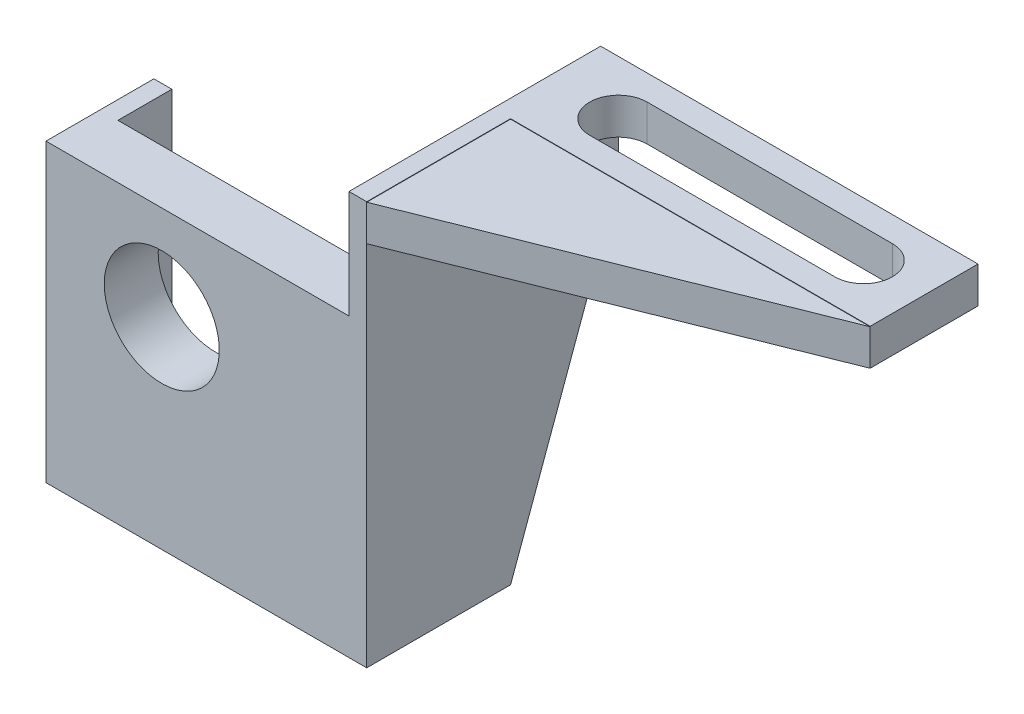
ISO-10303-21;
HEADER;
FILE_DESCRIPTION(('STEP AP214'),'2;1');
FILE_NAME('part.step','',(''),(''),'','','');
FILE_SCHEMA(('AUTOMOTIVE_DESIGN { 1 0 10303 214 1 1 1 1 }'));
ENDSEC;
DATA;
#1=APPLICATION_CONTEXT('core data for automotive mechanical design processes');
#2=APPLICATION_PROTOCOL_DEFINITION('international standard','automotive_design',2000,#1);
#3=PRODUCT_CONTEXT('',#1,'mechanical');
#4=PRODUCT('Part','Part','',(#3));
#5=PRODUCT_RELATED_PRODUCT_CATEGORY('part','',(#4));
#6=PRODUCT_DEFINITION_FORMATION('','',#4);
#7=PRODUCT_DEFINITION_CONTEXT('part definition',#1,'design');
#8=PRODUCT_DEFINITION('design','',#6,#7);
#9=PRODUCT_DEFINITION_SHAPE('','',#8);
#10=(LENGTH_UNIT() NAMED_UNIT(*) SI_UNIT(.MILLI.,.METRE.));
#11=(NAMED_UNIT(*) PLANE_ANGLE_UNIT() SI_UNIT($,.RADIAN.));
#12=(NAMED_UNIT(*) SI_UNIT($,.STERADIAN.) SOLID_ANGLE_UNIT());
#13=UNCERTAINTY_MEASURE_WITH_UNIT(LENGTH_MEASURE(1.E-05),#10,'distance_accuracy_value','');
#14=(GEOMETRIC_REPRESENTATION_CONTEXT(3) GLOBAL_UNCERTAINTY_ASSIGNED_CONTEXT((#13)) GLOBAL_UNIT_ASSIGNED_CONTEXT((#10,
#11,#12)) REPRESENTATION_CONTEXT('',''));
#15=CARTESIAN_POINT('',(0.,0.,0.));
#16=DIRECTION('',(0.,0.,1.));
#17=DIRECTION('',(1.,0.,0.));
#18=AXIS2_PLACEMENT_3D('',#15,#16,#17);
#19=CARTESIAN_POINT('',(-73.255482094098,0.,0.));
#20=DIRECTION('',(1.,0.,0.));
#21=DIRECTION('',(0.,-1.,0.));
#22=AXIS2_PLACEMENT_3D('',#19,#20,#21);
#23=PLANE('',#22);
#24=DIRECTION('',(0.,1.,0.));
#25=VECTOR('',#24,1.);
#26=CARTESIAN_POINT('',(-73.255482094098,7.3452534562212,3.));
#27=LINE('',#26,#25);
#28=CARTESIAN_POINT('',(-73.255482094098,-9.1097465437788,3.));
#29=VERTEX_POINT('',#28);
#30=CARTESIAN_POINT('',(-73.255482094098,11.3211667033944,3.));
#31=VERTEX_POINT('',#30);
#32=EDGE_CURVE('E373',#29,#31,#27,.T.);
#33=ORIENTED_EDGE('',*,*,#32,.F.);
#34=DIRECTION('',(0.,0.,1.));
#35=VECTOR('',#34,1.);
#36=CARTESIAN_POINT('',(-73.255482094098,-9.1097465437788,0.));
#37=LINE('',#36,#35);
#38=CARTESIAN_POINT('',(-73.255482094098,-9.1097465437788,-5.));
#39=VERTEX_POINT('',#38);
#40=EDGE_CURVE('E369',#39,#29,#37,.T.);
#41=ORIENTED_EDGE('',*,*,#40,.F.);
#42=DIRECTION('',(0.,-0.939493001584619,0.342568095381812));
#43=VECTOR('',#42,1.);
#44=CARTESIAN_POINT('',(-73.255482094098,7.3452534562212,-11.));
#45=LINE('',#44,#43);
#46=CARTESIAN_POINT('',(-73.255482094098,7.3452534562212,-11.));
#47=VERTEX_POINT('',#46);
#48=EDGE_CURVE('E313',#47,#39,#45,.T.);
#49=ORIENTED_EDGE('',*,*,#48,.F.);
#50=DIRECTION('',(0.,1.,0.));
#51=VECTOR('',#50,1.);
#52=CARTESIAN_POINT('',(-73.255482094098,13.3452534562212,-11.));
#53=LINE('',#52,#51);
#54=CARTESIAN_POINT('',(-73.255482094098,11.3211667033944,-11.));
#55=VERTEX_POINT('',#54);
#56=EDGE_CURVE('E331',#47,#55,#53,.T.);
#57=ORIENTED_EDGE('',*,*,#56,.T.);
#58=DIRECTION('',(0.,0.,1.));
#59=VECTOR('',#58,1.);
#60=CARTESIAN_POINT('',(-73.255482094098,11.3211667033944,-11.));
#61=LINE('',#60,#59);
#62=EDGE_CURVE('E195',#55,#31,#61,.T.);
#63=ORIENTED_EDGE('',*,*,#62,.T.);
#64=EDGE_LOOP('',(#33,#41,#49,#57,#63));
#65=FACE_BOUND('',#64,.T.);
#66=ADVANCED_FACE('F45',(#65),#23,.T.);
#67=CARTESIAN_POINT('',(-83.7793032493779,0.,0.));
#68=DIRECTION('',(0.,0.,1.));
#69=DIRECTION('',(-1.,0.,0.));
#70=AXIS2_PLACEMENT_3D('',#67,#68,#69);
#71=PLANE('',#70);
#72=CARTESIAN_POINT('',(-84.655482094098,2.0902534562212,0.));
#73=DIRECTION('',(0.,0.,-1.));
#74=DIRECTION('',(-1.,0.,0.));
#75=AXIS2_PLACEMENT_3D('',#72,#73,#74);
#76=CIRCLE('',#75,3.2);
#77=CARTESIAN_POINT('',(-87.855482094098,2.0902534562212,0.));
#78=VERTEX_POINT('',#77);
#79=EDGE_CURVE('E386',#78,#78,#76,.T.);
#80=ORIENTED_EDGE('',*,*,#79,.F.);
#81=EDGE_LOOP('',(#80));
#82=FACE_BOUND('',#81,.T.);
#83=CARTESIAN_POINT('',(-84.655482094098,-6.0797465437788,0.));
#84=DIRECTION('',(0.,0.,-1.));
#85=DIRECTION('',(-1.,0.,0.));
#86=AXIS2_PLACEMENT_3D('',#83,#84,#85);
#87=CIRCLE('',#86,1.65);
#88=CARTESIAN_POINT('',(-86.305482094098,-6.0797465437788,0.));
#89=VERTEX_POINT('',#88);
#90=EDGE_CURVE('E11',#89,#89,#87,.F.);
#91=ORIENTED_EDGE('',*,*,#90,.T.);
#92=EDGE_LOOP('',(#91));
#93=FACE_BOUND('',#92,.T.);
#94=DIRECTION('',(0.,1.,0.));
#95=VECTOR('',#94,1.);
#96=CARTESIAN_POINT('',(-90.095482094098,7.3452534562212,0.));
#97=LINE('',#96,#95);
#98=CARTESIAN_POINT('',(-90.095482094098,-9.1097465437788,0.));
#99=VERTEX_POINT('',#98);
#100=CARTESIAN_POINT('',(-90.095482094098,7.3452534562212,0.));
#101=VERTEX_POINT('',#100);
#102=EDGE_CURVE('E206',#99,#101,#97,.T.);
#103=ORIENTED_EDGE('',*,*,#102,.T.);
#104=DIRECTION('',(1.,0.,0.));
#105=VECTOR('',#104,1.);
#106=CARTESIAN_POINT('',(-77.255482094098,7.3452534562212,0.));
#107=LINE('',#106,#105);
#108=CARTESIAN_POINT('',(-74.255482094098,7.3452534562212,0.));
#109=VERTEX_POINT('',#108);
#110=EDGE_CURVE('E394',#101,#109,#107,.T.);
#111=ORIENTED_EDGE('',*,*,#110,.T.);
#112=DIRECTION('',(0.,-1.,0.));
#113=VECTOR('',#112,1.);
#114=CARTESIAN_POINT('',(-74.255482094098,7.3452534562212,0.));
#115=LINE('',#114,#113);
#116=CARTESIAN_POINT('',(-74.255482094098,-9.1097465437788,0.));
#117=VERTEX_POINT('',#116);
#118=EDGE_CURVE('E356',#109,#117,#115,.T.);
#119=ORIENTED_EDGE('',*,*,#118,.T.);
#120=DIRECTION('',(-1.,0.,0.));
#121=VECTOR('',#120,1.);
#122=CARTESIAN_POINT('',(-77.255482094098,-9.1097465437788,0.));
#123=LINE('',#122,#121);
#124=EDGE_CURVE('E382',#117,#99,#123,.T.);
#125=ORIENTED_EDGE('',*,*,#124,.T.);
#126=EDGE_LOOP('',(#103,#111,#119,#125));
#127=FACE_BOUND('',#126,.T.);
#128=ADVANCED_FACE('F404',(#82,#93,#127),#71,.F.);
#129=CARTESIAN_POINT('',(-77.255482094098,7.3452534562212,3.));
#130=DIRECTION('',(0.,-1.,0.));
#131=DIRECTION('',(0.,0.,-1.));
#132=AXIS2_PLACEMENT_3D('',#129,#130,#131);
#133=PLANE('',#132);
#134=DIRECTION('',(0.,0.,-1.));
#135=VECTOR('',#134,1.);
#136=CARTESIAN_POINT('',(-74.2437734444606,7.3452534562212,-5.));
#137=LINE('',#136,#135);
#138=CARTESIAN_POINT('',(-74.2437734444606,7.3452534562212,3.));
#139=VERTEX_POINT('',#138);
#140=CARTESIAN_POINT('',(-74.2437734444606,7.3452534562212,-11.));
#141=VERTEX_POINT('',#140);
#142=EDGE_CURVE('E338',#139,#141,#137,.T.);
#143=ORIENTED_EDGE('',*,*,#142,.T.);
#144=DIRECTION('',(1.,0.,0.));
#145=VECTOR('',#144,1.);
#146=CARTESIAN_POINT('',(-74.255482094098,7.3452534562212,-11.));
#147=LINE('',#146,#145);
#148=CARTESIAN_POINT('',(-74.255482094098,7.3452534562212,-11.));
#149=VERTEX_POINT('',#148);
#150=EDGE_CURVE('E317',#149,#141,#147,.T.);
#151=ORIENTED_EDGE('',*,*,#150,.F.);
#152=DIRECTION('',(0.,0.,1.));
#153=VECTOR('',#152,1.);
#154=CARTESIAN_POINT('',(-74.255482094098,7.3452534562212,-5.));
#155=LINE('',#154,#153);
#156=EDGE_CURVE('E366',#149,#109,#155,.T.);
#157=ORIENTED_EDGE('',*,*,#156,.T.);
#158=ORIENTED_EDGE('',*,*,#110,.F.);
#159=DIRECTION('',(0.,0.,1.));
#160=VECTOR('',#159,1.);
#161=CARTESIAN_POINT('',(-90.095482094098,7.3452534562212,-3.));
#162=LINE('',#161,#160);
#163=CARTESIAN_POINT('',(-90.095482094098,7.3452534562212,-3.));
#164=VERTEX_POINT('',#163);
#165=EDGE_CURVE('E228',#164,#101,#162,.T.);
#166=ORIENTED_EDGE('',*,*,#165,.F.);
#167=DIRECTION('',(-1.,0.,0.));
#168=VECTOR('',#167,1.);
#169=CARTESIAN_POINT('',(-91.095482094098,7.3452534562212,-3.));
#170=LINE('',#169,#168);
#171=CARTESIAN_POINT('',(-91.095482094098,7.3452534562212,-3.));
#172=VERTEX_POINT('',#171);
#173=EDGE_CURVE('E224',#164,#172,#170,.T.);
#174=ORIENTED_EDGE('',*,*,#173,.T.);
#175=DIRECTION('',(0.,0.,1.));
#176=VECTOR('',#175,1.);
#177=CARTESIAN_POINT('',(-91.095482094098,7.3452534562212,3.));
#178=LINE('',#177,#176);
#179=CARTESIAN_POINT('',(-91.095482094098,7.3452534562212,3.));
#180=VERTEX_POINT('',#179);
#181=EDGE_CURVE('E245',#172,#180,#178,.T.);
#182=ORIENTED_EDGE('',*,*,#181,.T.);
#183=DIRECTION('',(1.,0.,0.));
#184=VECTOR('',#183,1.);
#185=CARTESIAN_POINT('',(-77.255482094098,7.3452534562212,3.));
#186=LINE('',#185,#184);
#187=EDGE_CURVE('E54',#180,#139,#186,.T.);
#188=ORIENTED_EDGE('',*,*,#187,.T.);
#189=EDGE_LOOP('',(#143,#151,#157,#158,#166,#174,#182,#188));
#190=FACE_BOUND('',#189,.T.);
#191=ADVANCED_FACE('F47',(#190),#133,.F.);
#192=CARTESIAN_POINT('',(-83.7793032493779,0.,3.));
#193=DIRECTION('',(0.,0.,1.));
#194=DIRECTION('',(-1.,0.,0.));
#195=AXIS2_PLACEMENT_3D('',#192,#193,#194);
#196=PLANE('',#195);
#197=DIRECTION('',(-1.,0.,0.));
#198=VECTOR('',#197,1.);
#199=CARTESIAN_POINT('',(-77.255482094098,-9.1097465437788,3.));
#200=LINE('',#199,#198);
#201=CARTESIAN_POINT('',(-91.095482094098,-9.1097465437788,3.));
#202=VERTEX_POINT('',#201);
#203=EDGE_CURVE('E381',#29,#202,#200,.T.);
#204=ORIENTED_EDGE('',*,*,#203,.F.);
#205=ORIENTED_EDGE('',*,*,#32,.T.);
#206=DIRECTION('',(0.,-1.,0.));
#207=VECTOR('',#206,1.);
#208=CARTESIAN_POINT('',(-73.255482094098,13.3211667033944,3.));
#209=LINE('',#208,#207);
#210=CARTESIAN_POINT('',(-73.255482094098,13.3211667033944,3.));
#211=VERTEX_POINT('',#210);
#212=EDGE_CURVE('E202',#211,#31,#209,.T.);
#213=ORIENTED_EDGE('',*,*,#212,.F.);
#214=CARTESIAN_POINT('',(-73.255482094098,13.3452534562212,3.));
#215=VERTEX_POINT('',#214);
#216=EDGE_CURVE('E199',#211,#215,#27,.T.);
#217=ORIENTED_EDGE('',*,*,#216,.T.);
#218=DIRECTION('',(-1.,0.,0.));
#219=VECTOR('',#218,1.);
#220=CARTESIAN_POINT('',(-73.255482094098,13.3452534562212,3.));
#221=LINE('',#220,#219);
#222=CARTESIAN_POINT('',(-74.2437734444606,13.3452534562212,3.));
#223=VERTEX_POINT('',#222);
#224=EDGE_CURVE('E342',#215,#223,#221,.T.);
#225=ORIENTED_EDGE('',*,*,#224,.T.);
#226=DIRECTION('',(0.,-1.,0.));
#227=VECTOR('',#226,1.);
#228=CARTESIAN_POINT('',(-74.2437734444606,13.3452534562212,3.));
#229=LINE('',#228,#227);
#230=EDGE_CURVE('E350',#223,#139,#229,.T.);
#231=ORIENTED_EDGE('',*,*,#230,.T.);
#232=ORIENTED_EDGE('',*,*,#187,.F.);
#233=DIRECTION('',(0.,-1.,0.));
#234=VECTOR('',#233,1.);
#235=CARTESIAN_POINT('',(-91.095482094098,7.3452534562212,3.));
#236=LINE('',#235,#234);
#237=EDGE_CURVE('E237',#180,#202,#236,.T.);
#238=ORIENTED_EDGE('',*,*,#237,.T.);
#239=EDGE_LOOP('',(#204,#205,#213,#217,#225,#231,#232,#238));
#240=FACE_BOUND('',#239,.T.);
#241=CARTESIAN_POINT('',(-84.655482094098,2.0902534562212,3.));
#242=DIRECTION('',(0.,0.,-1.));
#243=DIRECTION('',(-1.,0.,0.));
#244=AXIS2_PLACEMENT_3D('',#241,#242,#243);
#245=CIRCLE('',#244,3.2);
#246=CARTESIAN_POINT('',(-87.855482094098,2.0902534562212,3.));
#247=VERTEX_POINT('',#246);
#248=EDGE_CURVE('E390',#247,#247,#245,.T.);
#249=ORIENTED_EDGE('',*,*,#248,.T.);
#250=EDGE_LOOP('',(#249));
#251=FACE_BOUND('',#250,.T.);
#252=ADVANCED_FACE('F431',(#240,#251),#196,.T.);
#253=CARTESIAN_POINT('',(-84.655482094098,2.0902534562212,3.));
#254=DIRECTION('',(0.,0.,-1.));
#255=DIRECTION('',(1.,0.,0.));
#256=AXIS2_PLACEMENT_3D('',#253,#254,#255);
#257=CYLINDRICAL_SURFACE('',#256,3.2);
#258=ORIENTED_EDGE('',*,*,#248,.F.);
#259=EDGE_LOOP('',(#258));
#260=FACE_BOUND('',#259,.T.);
#261=ORIENTED_EDGE('',*,*,#79,.T.);
#262=EDGE_LOOP('',(#261));
#263=FACE_BOUND('',#262,.T.);
#264=ADVANCED_FACE('F496',(#260,#263),#257,.F.);
#265=CARTESIAN_POINT('',(-77.255482094098,-9.1097465437788,0.));
#266=DIRECTION('',(0.,-1.,0.));
#267=DIRECTION('',(0.,0.,-1.));
#268=AXIS2_PLACEMENT_3D('',#265,#266,#267);
#269=PLANE('',#268);
#270=DIRECTION('',(0.,0.,-1.));
#271=VECTOR('',#270,1.);
#272=CARTESIAN_POINT('',(-91.095482094098,-9.1097465437788,3.));
#273=LINE('',#272,#271);
#274=CARTESIAN_POINT('',(-91.095482094098,-9.1097465437788,-3.));
#275=VERTEX_POINT('',#274);
#276=EDGE_CURVE('E241',#202,#275,#273,.T.);
#277=ORIENTED_EDGE('',*,*,#276,.T.);
#278=DIRECTION('',(1.,0.,0.));
#279=VECTOR('',#278,1.);
#280=CARTESIAN_POINT('',(-91.095482094098,-9.1097465437788,-3.));
#281=LINE('',#280,#279);
#282=CARTESIAN_POINT('',(-90.095482094098,-9.1097465437788,-3.));
#283=VERTEX_POINT('',#282);
#284=EDGE_CURVE('E217',#275,#283,#281,.T.);
#285=ORIENTED_EDGE('',*,*,#284,.T.);
#286=DIRECTION('',(0.,0.,1.));
#287=VECTOR('',#286,1.);
#288=CARTESIAN_POINT('',(-90.095482094098,-9.1097465437788,-3.));
#289=LINE('',#288,#287);
#290=EDGE_CURVE('E234',#283,#99,#289,.T.);
#291=ORIENTED_EDGE('',*,*,#290,.T.);
#292=ORIENTED_EDGE('',*,*,#124,.F.);
#293=DIRECTION('',(0.,0.,1.));
#294=VECTOR('',#293,1.);
#295=CARTESIAN_POINT('',(-74.255482094098,-9.1097465437788,-5.));
#296=LINE('',#295,#294);
#297=CARTESIAN_POINT('',(-74.255482094098,-9.1097465437788,-5.));
#298=VERTEX_POINT('',#297);
#299=EDGE_CURVE('E360',#298,#117,#296,.T.);
#300=ORIENTED_EDGE('',*,*,#299,.F.);
#301=DIRECTION('',(1.,0.,0.));
#302=VECTOR('',#301,1.);
#303=CARTESIAN_POINT('',(-73.255482094098,-9.1097465437788,-5.));
#304=LINE('',#303,#302);
#305=EDGE_CURVE('E357',#298,#39,#304,.T.);
#306=ORIENTED_EDGE('',*,*,#305,.T.);
#307=ORIENTED_EDGE('',*,*,#40,.T.);
#308=ORIENTED_EDGE('',*,*,#203,.T.);
#309=EDGE_LOOP('',(#277,#285,#291,#292,#300,#306,#307,#308));
#310=FACE_BOUND('',#309,.T.);
#311=ADVANCED_FACE('F417',(#310),#269,.T.);
#312=CARTESIAN_POINT('',(-84.655482094098,-6.0797465437788,-3.));
#313=DIRECTION('',(0.,0.,1.));
#314=DIRECTION('',(-1.,0.,0.));
#315=AXIS2_PLACEMENT_3D('',#312,#313,#314);
#316=CYLINDRICAL_SURFACE('',#315,1.65);
#317=CARTESIAN_POINT('',(-84.655482094098,-6.0797465437788,-3.));
#318=DIRECTION('',(0.,0.,1.));
#319=DIRECTION('',(1.,0.,0.));
#320=AXIS2_PLACEMENT_3D('',#317,#318,#319);
#321=CIRCLE('',#320,1.65);
#322=CARTESIAN_POINT('',(-83.005482094098,-6.0797465437788,-3.));
#323=VERTEX_POINT('',#322);
#324=EDGE_CURVE('E377',#323,#323,#321,.T.);
#325=ORIENTED_EDGE('',*,*,#324,.T.);
#326=EDGE_LOOP('',(#325));
#327=FACE_BOUND('',#326,.T.);
#328=ORIENTED_EDGE('',*,*,#90,.F.);
#329=EDGE_LOOP('',(#328));
#330=FACE_BOUND('',#329,.T.);
#331=ADVANCED_FACE('F485',(#327,#330),#316,.T.);
#332=CARTESIAN_POINT('',(-84.655482094098,-6.0797465437788,-3.));
#333=DIRECTION('',(0.,0.,-1.));
#334=DIRECTION('',(1.,0.,0.));
#335=AXIS2_PLACEMENT_3D('',#332,#333,#334);
#336=PLANE('',#335);
#337=ORIENTED_EDGE('',*,*,#324,.F.);
#338=EDGE_LOOP('',(#337));
#339=FACE_BOUND('',#338,.T.);
#340=ADVANCED_FACE('F480',(#339),#336,.T.);
#341=DIRECTION('',(0.,0.,1.));
#342=VECTOR('',#341,1.);
#343=CARTESIAN_POINT('',(-73.255482094098,13.3211667033944,-5.));
#344=LINE('',#343,#342);
#345=CARTESIAN_POINT('',(-73.255482094098,13.3211667033944,-5.));
#346=VERTEX_POINT('',#345);
#347=EDGE_CURVE('E180',#346,#211,#344,.T.);
#348=ORIENTED_EDGE('',*,*,#347,.F.);
#349=DIRECTION('',(0.,1.,0.));
#350=VECTOR('',#349,1.);
#351=CARTESIAN_POINT('',(-73.255482094098,13.3452534562212,-5.));
#352=LINE('',#351,#350);
#353=CARTESIAN_POINT('',(-73.255482094098,13.3452534562212,-5.));
#354=VERTEX_POINT('',#353);
#355=EDGE_CURVE('E187',#346,#354,#352,.T.);
#356=ORIENTED_EDGE('',*,*,#355,.T.);
#357=DIRECTION('',(0.,0.,1.));
#358=VECTOR('',#357,1.);
#359=CARTESIAN_POINT('',(-73.255482094098,13.3452534562212,-5.));
#360=LINE('',#359,#358);
#361=EDGE_CURVE('E339',#354,#215,#360,.T.);
#362=ORIENTED_EDGE('',*,*,#361,.T.);
#363=ORIENTED_EDGE('',*,*,#216,.F.);
#364=EDGE_LOOP('',(#348,#356,#362,#363));
#365=FACE_BOUND('',#364,.T.);
#366=ADVANCED_FACE('F197',(#365),#23,.T.);
#367=CARTESIAN_POINT('',(-74.255482094098,7.3452534562212,-5.));
#368=DIRECTION('',(1.,0.,0.));
#369=DIRECTION('',(0.,-1.,0.));
#370=AXIS2_PLACEMENT_3D('',#367,#368,#369);
#371=PLANE('',#370);
#372=ORIENTED_EDGE('',*,*,#118,.F.);
#373=ORIENTED_EDGE('',*,*,#156,.F.);
#374=DIRECTION('',(0.,-0.939493001584619,0.342568095381812));
#375=VECTOR('',#374,1.);
#376=CARTESIAN_POINT('',(-74.255482094098,7.3452534562212,-11.));
#377=LINE('',#376,#375);
#378=EDGE_CURVE('E314',#149,#298,#377,.T.);
#379=ORIENTED_EDGE('',*,*,#378,.T.);
#380=ORIENTED_EDGE('',*,*,#299,.T.);
#381=EDGE_LOOP('',(#372,#373,#379,#380));
#382=FACE_BOUND('',#381,.T.);
#383=ADVANCED_FACE('F412',(#382),#371,.F.);
#384=CARTESIAN_POINT('',(-74.2437734444606,13.3452534562212,-5.));
#385=DIRECTION('',(1.,0.,0.));
#386=DIRECTION('',(0.,0.,1.));
#387=AXIS2_PLACEMENT_3D('',#384,#385,#386);
#388=PLANE('',#387);
#389=ORIENTED_EDGE('',*,*,#142,.F.);
#390=ORIENTED_EDGE('',*,*,#230,.F.);
#391=DIRECTION('',(0.,0.,-1.));
#392=VECTOR('',#391,1.);
#393=CARTESIAN_POINT('',(-74.2437734444606,13.3452534562212,-5.));
#394=LINE('',#393,#392);
#395=CARTESIAN_POINT('',(-74.2437734444606,13.3452534562212,-11.));
#396=VERTEX_POINT('',#395);
#397=EDGE_CURVE('E346',#223,#396,#394,.T.);
#398=ORIENTED_EDGE('',*,*,#397,.T.);
#399=DIRECTION('',(0.,-1.,0.));
#400=VECTOR('',#399,1.);
#401=CARTESIAN_POINT('',(-74.2437734444606,13.3452534562212,-11.));
#402=LINE('',#401,#400);
#403=EDGE_CURVE('E324',#396,#141,#402,.T.);
#404=ORIENTED_EDGE('',*,*,#403,.T.);
#405=EDGE_LOOP('',(#389,#390,#398,#404));
#406=FACE_BOUND('',#405,.T.);
#407=ADVANCED_FACE('F436',(#406),#388,.F.);
#408=CARTESIAN_POINT('',(-83.7793032493779,13.3452534562212,0.));
#409=DIRECTION('',(0.,1.,0.));
#410=DIRECTION('',(0.,0.,1.));
#411=AXIS2_PLACEMENT_3D('',#408,#409,#410);
#412=PLANE('',#411);
#413=CARTESIAN_POINT('',(-56.6191347499063,13.3452534562212,-8.));
#414=DIRECTION('',(0.,1.,0.));
#415=DIRECTION('',(-1.,0.,0.));
#416=AXIS2_PLACEMENT_3D('',#413,#414,#415);
#417=CIRCLE('',#416,1.6);
#418=CARTESIAN_POINT('',(-56.6191347499063,13.3452534562212,-6.4));
#419=VERTEX_POINT('',#418);
#420=CARTESIAN_POINT('',(-56.6191347499063,13.3452534562212,-9.6));
#421=VERTEX_POINT('',#420);
#422=EDGE_CURVE('E250',#419,#421,#417,.T.);
#423=ORIENTED_EDGE('',*,*,#422,.F.);
#424=DIRECTION('',(1.,0.,0.));
#425=VECTOR('',#424,1.);
#426=CARTESIAN_POINT('',(-56.6191347499063,13.3452534562212,-6.4));
#427=LINE('',#426,#425);
#428=CARTESIAN_POINT('',(-70.255482094098,13.3452534562212,-6.4));
#429=VERTEX_POINT('',#428);
#430=EDGE_CURVE('E261',#429,#419,#427,.T.);
#431=ORIENTED_EDGE('',*,*,#430,.F.);
#432=CARTESIAN_POINT('',(-70.255482094098,13.3452534562212,-8.));
#433=DIRECTION('',(0.,1.,0.));
#434=DIRECTION('',(-1.,0.,0.));
#435=AXIS2_PLACEMENT_3D('',#432,#433,#434);
#436=CIRCLE('',#435,1.6);
#437=CARTESIAN_POINT('',(-70.255482094098,13.3452534562212,-9.6));
#438=VERTEX_POINT('',#437);
#439=EDGE_CURVE('E258',#438,#429,#436,.T.);
#440=ORIENTED_EDGE('',*,*,#439,.F.);
#441=DIRECTION('',(-1.,0.,0.));
#442=VECTOR('',#441,1.);
#443=CARTESIAN_POINT('',(-56.6191347499063,13.3452534562212,-9.6));
#444=LINE('',#443,#442);
#445=EDGE_CURVE('E254',#421,#438,#444,.T.);
#446=ORIENTED_EDGE('',*,*,#445,.F.);
#447=EDGE_LOOP('',(#423,#431,#440,#446));
#448=FACE_BOUND('',#447,.T.);
#449=DIRECTION('',(-1.,0.,0.));
#450=VECTOR('',#449,1.);
#451=CARTESIAN_POINT('',(-74.2437734444606,13.3452534562212,-11.));
#452=LINE('',#451,#450);
#453=CARTESIAN_POINT('',(-53.255482094098,13.3452534562212,-11.));
#454=VERTEX_POINT('',#453);
#455=EDGE_CURVE('E335',#454,#396,#452,.T.);
#456=ORIENTED_EDGE('',*,*,#455,.T.);
#457=ORIENTED_EDGE('',*,*,#397,.F.);
#458=ORIENTED_EDGE('',*,*,#224,.F.);
#459=ORIENTED_EDGE('',*,*,#361,.F.);
#460=DIRECTION('',(-1.,0.,0.));
#461=VECTOR('',#460,1.);
#462=CARTESIAN_POINT('',(-53.255482094098,13.3452534562212,-5.));
#463=LINE('',#462,#461);
#464=CARTESIAN_POINT('',(-53.255482094098,13.3452534562212,-5.));
#465=VERTEX_POINT('',#464);
#466=EDGE_CURVE('E190',#465,#354,#463,.T.);
#467=ORIENTED_EDGE('',*,*,#466,.F.);
#468=DIRECTION('',(0.,0.,-1.));
#469=VECTOR('',#468,1.);
#470=CARTESIAN_POINT('',(-53.255482094098,13.3452534562212,-11.));
#471=LINE('',#470,#469);
#472=EDGE_CURVE('E301',#465,#454,#471,.T.);
#473=ORIENTED_EDGE('',*,*,#472,.T.);
#474=EDGE_LOOP('',(#456,#457,#458,#459,#467,#473));
#475=FACE_BOUND('',#474,.T.);
#476=ADVANCED_FACE('F458',(#448,#475),#412,.T.);
#477=CARTESIAN_POINT('',(-83.7793032493779,0.,-11.));
#478=DIRECTION('',(0.,0.,-1.));
#479=DIRECTION('',(1.,0.,0.));
#480=AXIS2_PLACEMENT_3D('',#477,#478,#479);
#481=PLANE('',#480);
#482=ORIENTED_EDGE('',*,*,#403,.F.);
#483=ORIENTED_EDGE('',*,*,#455,.F.);
#484=DIRECTION('',(0.,-1.,0.));
#485=VECTOR('',#484,1.);
#486=CARTESIAN_POINT('',(-53.255482094098,13.3452534562212,-11.));
#487=LINE('',#486,#485);
#488=CARTESIAN_POINT('',(-53.255482094098,11.3211667033944,-11.));
#489=VERTEX_POINT('',#488);
#490=EDGE_CURVE('E194',#454,#489,#487,.T.);
#491=ORIENTED_EDGE('',*,*,#490,.T.);
#492=DIRECTION('',(-1.,0.,0.));
#493=VECTOR('',#492,1.);
#494=CARTESIAN_POINT('',(-53.255482094098,11.3211667033944,-11.));
#495=LINE('',#494,#493);
#496=EDGE_CURVE('E310',#489,#55,#495,.T.);
#497=ORIENTED_EDGE('',*,*,#496,.T.);
#498=ORIENTED_EDGE('',*,*,#56,.F.);
#499=DIRECTION('',(1.,0.,0.));
#500=VECTOR('',#499,1.);
#501=CARTESIAN_POINT('',(-74.2437734444606,7.3452534562212,-11.));
#502=LINE('',#501,#500);
#503=EDGE_CURVE('E328',#141,#47,#502,.T.);
#504=ORIENTED_EDGE('',*,*,#503,.F.);
#505=EDGE_LOOP('',(#482,#483,#491,#497,#498,#504));
#506=FACE_BOUND('',#505,.T.);
#507=ADVANCED_FACE('F459',(#506),#481,.T.);
#508=CARTESIAN_POINT('',(-74.255482094098,7.3452534562212,-11.));
#509=DIRECTION('',(0.,-0.342568095381812,-0.93949300158462));
#510=DIRECTION('',(0.,0.93949300158462,-0.342568095381812));
#511=AXIS2_PLACEMENT_3D('',#508,#509,#510);
#512=PLANE('',#511);
#513=ORIENTED_EDGE('',*,*,#48,.T.);
#514=ORIENTED_EDGE('',*,*,#305,.F.);
#515=ORIENTED_EDGE('',*,*,#378,.F.);
#516=ORIENTED_EDGE('',*,*,#150,.T.);
#517=ORIENTED_EDGE('',*,*,#503,.T.);
#518=EDGE_LOOP('',(#513,#514,#515,#516,#517));
#519=FACE_BOUND('',#518,.T.);
#520=ADVANCED_FACE('F441',(#519),#512,.T.);
#521=CARTESIAN_POINT('',(-53.255482094098,11.3211667033944,-11.));
#522=DIRECTION('',(0.,1.,0.));
#523=DIRECTION('',(1.,0.,0.));
#524=AXIS2_PLACEMENT_3D('',#521,#522,#523);
#525=PLANE('',#524);
#526=DIRECTION('',(-1.,0.,0.));
#527=VECTOR('',#526,1.);
#528=CARTESIAN_POINT('',(-56.6191347499063,11.3211667033944,-9.6));
#529=LINE('',#528,#527);
#530=CARTESIAN_POINT('',(-56.6191347499063,11.3211667033944,-9.6));
#531=VERTEX_POINT('',#530);
#532=CARTESIAN_POINT('',(-70.255482094098,11.3211667033944,-9.6));
#533=VERTEX_POINT('',#532);
#534=EDGE_CURVE('E269',#531,#533,#529,.T.);
#535=ORIENTED_EDGE('',*,*,#534,.T.);
#536=CARTESIAN_POINT('',(-70.255482094098,11.3211667033944,-8.));
#537=DIRECTION('',(0.,1.,0.));
#538=DIRECTION('',(-1.,0.,0.));
#539=AXIS2_PLACEMENT_3D('',#536,#537,#538);
#540=CIRCLE('',#539,1.6);
#541=CARTESIAN_POINT('',(-70.255482094098,11.3211667033944,-6.4));
#542=VERTEX_POINT('',#541);
#543=EDGE_CURVE('E273',#533,#542,#540,.T.);
#544=ORIENTED_EDGE('',*,*,#543,.T.);
#545=DIRECTION('',(1.,0.,0.));
#546=VECTOR('',#545,1.);
#547=CARTESIAN_POINT('',(-56.6191347499063,11.3211667033944,-6.4));
#548=LINE('',#547,#546);
#549=CARTESIAN_POINT('',(-56.6191347499063,11.3211667033944,-6.4));
#550=VERTEX_POINT('',#549);
#551=EDGE_CURVE('E255',#542,#550,#548,.T.);
#552=ORIENTED_EDGE('',*,*,#551,.T.);
#553=CARTESIAN_POINT('',(-56.6191347499063,11.3211667033944,-8.));
#554=DIRECTION('',(0.,1.,0.));
#555=DIRECTION('',(-1.,0.,0.));
#556=AXIS2_PLACEMENT_3D('',#553,#554,#555);
#557=CIRCLE('',#556,1.6);
#558=EDGE_CURVE('E249',#550,#531,#557,.T.);
#559=ORIENTED_EDGE('',*,*,#558,.T.);
#560=EDGE_LOOP('',(#535,#544,#552,#559));
#561=FACE_BOUND('',#560,.T.);
#562=ORIENTED_EDGE('',*,*,#62,.F.);
#563=ORIENTED_EDGE('',*,*,#496,.F.);
#564=DIRECTION('',(0.,0.,1.));
#565=VECTOR('',#564,1.);
#566=CARTESIAN_POINT('',(-53.255482094098,11.3211667033944,-11.));
#567=LINE('',#566,#565);
#568=CARTESIAN_POINT('',(-53.255482094098,11.3211667033944,-5.));
#569=VERTEX_POINT('',#568);
#570=EDGE_CURVE('E293',#489,#569,#567,.T.);
#571=ORIENTED_EDGE('',*,*,#570,.T.);
#572=DIRECTION('',(0.928476690885259,0.,-0.371390676354104));
#573=VECTOR('',#572,1.);
#574=CARTESIAN_POINT('',(-73.255482094098,11.3211667033944,3.));
#575=LINE('',#574,#573);
#576=EDGE_CURVE('E210',#31,#569,#575,.T.);
#577=ORIENTED_EDGE('',*,*,#576,.F.);
#578=EDGE_LOOP('',(#562,#563,#571,#577));
#579=FACE_BOUND('',#578,.T.);
#580=ADVANCED_FACE('F461',(#561,#579),#525,.F.);
#581=CARTESIAN_POINT('',(-53.255482094098,13.3452534562212,-5.));
#582=DIRECTION('',(0.,0.,-1.));
#583=DIRECTION('',(1.,0.,0.));
#584=AXIS2_PLACEMENT_3D('',#581,#582,#583);
#585=PLANE('',#584);
#586=DIRECTION('',(0.,1.,0.));
#587=VECTOR('',#586,1.);
#588=CARTESIAN_POINT('',(-53.255482094098,13.3452534562212,-5.));
#589=LINE('',#588,#587);
#590=CARTESIAN_POINT('',(-53.255482094098,13.3211667033944,-5.));
#591=VERTEX_POINT('',#590);
#592=EDGE_CURVE('E297',#591,#465,#589,.T.);
#593=ORIENTED_EDGE('',*,*,#592,.T.);
#594=ORIENTED_EDGE('',*,*,#466,.T.);
#595=ORIENTED_EDGE('',*,*,#355,.F.);
#596=DIRECTION('',(-1.,0.,0.));
#597=VECTOR('',#596,1.);
#598=CARTESIAN_POINT('',(-53.255482094098,13.3211667033944,-5.));
#599=LINE('',#598,#597);
#600=EDGE_CURVE('E176',#591,#346,#599,.T.);
#601=ORIENTED_EDGE('',*,*,#600,.F.);
#602=EDGE_LOOP('',(#593,#594,#595,#601));
#603=FACE_BOUND('',#602,.T.);
#604=ADVANCED_FACE('F188',(#603),#585,.F.);
#605=CARTESIAN_POINT('',(-53.255482094098,0.,0.));
#606=DIRECTION('',(1.,0.,0.));
#607=DIRECTION('',(0.,0.,1.));
#608=AXIS2_PLACEMENT_3D('',#605,#606,#607);
#609=PLANE('',#608);
#610=ORIENTED_EDGE('',*,*,#490,.F.);
#611=ORIENTED_EDGE('',*,*,#472,.F.);
#612=ORIENTED_EDGE('',*,*,#592,.F.);
#613=EDGE_CURVE('E298',#569,#591,#589,.T.);
#614=ORIENTED_EDGE('',*,*,#613,.F.);
#615=ORIENTED_EDGE('',*,*,#570,.F.);
#616=EDGE_LOOP('',(#610,#611,#612,#614,#615));
#617=FACE_BOUND('',#616,.T.);
#618=ADVANCED_FACE('F452',(#617),#609,.T.);
#619=CARTESIAN_POINT('',(-56.6191347499063,13.3452534562212,-8.));
#620=DIRECTION('',(0.,-1.,0.));
#621=DIRECTION('',(-1.,0.,0.));
#622=AXIS2_PLACEMENT_3D('',#619,#620,#621);
#623=CYLINDRICAL_SURFACE('',#622,1.6);
#624=ORIENTED_EDGE('',*,*,#558,.F.);
#625=DIRECTION('',(0.,-1.,0.));
#626=VECTOR('',#625,1.);
#627=CARTESIAN_POINT('',(-56.6191347499063,13.3452534562212,-6.4));
#628=LINE('',#627,#626);
#629=EDGE_CURVE('E280',#419,#550,#628,.T.);
#630=ORIENTED_EDGE('',*,*,#629,.F.);
#631=ORIENTED_EDGE('',*,*,#422,.T.);
#632=DIRECTION('',(0.,-1.,0.));
#633=VECTOR('',#632,1.);
#634=CARTESIAN_POINT('',(-56.6191347499063,13.3452534562212,-9.6));
#635=LINE('',#634,#633);
#636=EDGE_CURVE('E265',#421,#531,#635,.T.);
#637=ORIENTED_EDGE('',*,*,#636,.T.);
#638=EDGE_LOOP('',(#624,#630,#631,#637));
#639=FACE_BOUND('',#638,.T.);
#640=ADVANCED_FACE('F561',(#639),#623,.F.);
#641=CARTESIAN_POINT('',(-56.6191347499063,13.3452534562212,-6.4));
#642=DIRECTION('',(0.,0.,1.));
#643=DIRECTION('',(-1.,0.,0.));
#644=AXIS2_PLACEMENT_3D('',#641,#642,#643);
#645=PLANE('',#644);
#646=ORIENTED_EDGE('',*,*,#551,.F.);
#647=DIRECTION('',(0.,-1.,0.));
#648=VECTOR('',#647,1.);
#649=CARTESIAN_POINT('',(-70.255482094098,13.3452534562212,-6.4));
#650=LINE('',#649,#648);
#651=EDGE_CURVE('E283',#429,#542,#650,.T.);
#652=ORIENTED_EDGE('',*,*,#651,.F.);
#653=ORIENTED_EDGE('',*,*,#430,.T.);
#654=ORIENTED_EDGE('',*,*,#629,.T.);
#655=EDGE_LOOP('',(#646,#652,#653,#654));
#656=FACE_BOUND('',#655,.T.);
#657=ADVANCED_FACE('F553',(#656),#645,.F.);
#658=CARTESIAN_POINT('',(-70.255482094098,13.3452534562212,-8.));
#659=DIRECTION('',(0.,-1.,0.));
#660=DIRECTION('',(-1.,0.,0.));
#661=AXIS2_PLACEMENT_3D('',#658,#659,#660);
#662=CYLINDRICAL_SURFACE('',#661,1.6);
#663=ORIENTED_EDGE('',*,*,#543,.F.);
#664=DIRECTION('',(0.,-1.,0.));
#665=VECTOR('',#664,1.);
#666=CARTESIAN_POINT('',(-70.255482094098,13.3452534562212,-9.6));
#667=LINE('',#666,#665);
#668=EDGE_CURVE('E69',#438,#533,#667,.T.);
#669=ORIENTED_EDGE('',*,*,#668,.F.);
#670=ORIENTED_EDGE('',*,*,#439,.T.);
#671=ORIENTED_EDGE('',*,*,#651,.T.);
#672=EDGE_LOOP('',(#663,#669,#670,#671));
#673=FACE_BOUND('',#672,.T.);
#674=ADVANCED_FACE('F543',(#673),#662,.F.);
#675=CARTESIAN_POINT('',(-56.6191347499063,13.3452534562212,-9.6));
#676=DIRECTION('',(0.,0.,-1.));
#677=DIRECTION('',(1.,0.,0.));
#678=AXIS2_PLACEMENT_3D('',#675,#676,#677);
#679=PLANE('',#678);
#680=ORIENTED_EDGE('',*,*,#534,.F.);
#681=ORIENTED_EDGE('',*,*,#636,.F.);
#682=ORIENTED_EDGE('',*,*,#445,.T.);
#683=ORIENTED_EDGE('',*,*,#668,.T.);
#684=EDGE_LOOP('',(#680,#681,#682,#683));
#685=FACE_BOUND('',#684,.T.);
#686=ADVANCED_FACE('F538',(#685),#679,.F.);
#687=CARTESIAN_POINT('',(-91.095482094098,0.,0.));
#688=DIRECTION('',(-1.,0.,0.));
#689=DIRECTION('',(0.,0.,-1.));
#690=AXIS2_PLACEMENT_3D('',#687,#688,#689);
#691=PLANE('',#690);
#692=ORIENTED_EDGE('',*,*,#237,.F.);
#693=ORIENTED_EDGE('',*,*,#181,.F.);
#694=DIRECTION('',(0.,-1.,0.));
#695=VECTOR('',#694,1.);
#696=CARTESIAN_POINT('',(-91.095482094098,7.3452534562212,-3.));
#697=LINE('',#696,#695);
#698=EDGE_CURVE('E214',#172,#275,#697,.T.);
#699=ORIENTED_EDGE('',*,*,#698,.T.);
#700=ORIENTED_EDGE('',*,*,#276,.F.);
#701=EDGE_LOOP('',(#692,#693,#699,#700));
#702=FACE_BOUND('',#701,.T.);
#703=ADVANCED_FACE('F429',(#702),#691,.T.);
#704=CARTESIAN_POINT('',(-90.095482094098,7.3452534562212,-3.));
#705=DIRECTION('',(-1.,0.,0.));
#706=DIRECTION('',(0.,1.,0.));
#707=AXIS2_PLACEMENT_3D('',#704,#705,#706);
#708=PLANE('',#707);
#709=ORIENTED_EDGE('',*,*,#102,.F.);
#710=ORIENTED_EDGE('',*,*,#290,.F.);
#711=DIRECTION('',(0.,1.,0.));
#712=VECTOR('',#711,1.);
#713=CARTESIAN_POINT('',(-90.095482094098,7.3452534562212,-3.));
#714=LINE('',#713,#712);
#715=EDGE_CURVE('E221',#283,#164,#714,.T.);
#716=ORIENTED_EDGE('',*,*,#715,.T.);
#717=ORIENTED_EDGE('',*,*,#165,.T.);
#718=EDGE_LOOP('',(#709,#710,#716,#717));
#719=FACE_BOUND('',#718,.T.);
#720=ADVANCED_FACE('F420',(#719),#708,.F.);
#721=CARTESIAN_POINT('',(-83.7793032493779,0.,-3.));
#722=DIRECTION('',(0.,0.,-1.));
#723=DIRECTION('',(1.,0.,0.));
#724=AXIS2_PLACEMENT_3D('',#721,#722,#723);
#725=PLANE('',#724);
#726=ORIENTED_EDGE('',*,*,#698,.F.);
#727=ORIENTED_EDGE('',*,*,#173,.F.);
#728=ORIENTED_EDGE('',*,*,#715,.F.);
#729=ORIENTED_EDGE('',*,*,#284,.F.);
#730=EDGE_LOOP('',(#726,#727,#728,#729));
#731=FACE_BOUND('',#730,.T.);
#732=ADVANCED_FACE('F424',(#731),#725,.T.);
#733=CARTESIAN_POINT('',(-73.255482094098,13.3211667033944,3.));
#734=DIRECTION('',(0.371390676354104,0.,0.928476690885259));
#735=DIRECTION('',(-0.928476690885259,0.,0.371390676354104));
#736=AXIS2_PLACEMENT_3D('',#733,#734,#735);
#737=PLANE('',#736);
#738=ORIENTED_EDGE('',*,*,#576,.T.);
#739=ORIENTED_EDGE('',*,*,#613,.T.);
#740=DIRECTION('',(0.928476690885259,0.,-0.371390676354104));
#741=VECTOR('',#740,1.);
#742=CARTESIAN_POINT('',(-73.255482094098,13.3211667033944,3.));
#743=LINE('',#742,#741);
#744=EDGE_CURVE('E61',#211,#591,#743,.T.);
#745=ORIENTED_EDGE('',*,*,#744,.F.);
#746=ORIENTED_EDGE('',*,*,#212,.T.);
#747=EDGE_LOOP('',(#738,#739,#745,#746));
#748=FACE_BOUND('',#747,.T.);
#749=ADVANCED_FACE('F449',(#748),#737,.T.);
#750=CARTESIAN_POINT('',(-83.7793032493779,13.3211667033944,0.));
#751=DIRECTION('',(0.,1.,0.));
#752=DIRECTION('',(1.,0.,0.));
#753=AXIS2_PLACEMENT_3D('',#750,#751,#752);
#754=PLANE('',#753);
#755=ORIENTED_EDGE('',*,*,#744,.T.);
#756=ORIENTED_EDGE('',*,*,#600,.T.);
#757=ORIENTED_EDGE('',*,*,#347,.T.);
#758=EDGE_LOOP('',(#755,#756,#757));
#759=FACE_BOUND('',#758,.T.);
#760=ADVANCED_FACE('F178',(#759),#754,.T.);
#761=CLOSED_SHELL('',(#66,#128,#191,#252,#264,#311,#331,#340,#366,#383,#407,#476,#507,#520,#580,
#604,#618,#640,#657,#674,#686,#703,#720,#732,#749,#760));
#762=MANIFOLD_SOLID_BREP('B2',#761);
#763=ADVANCED_BREP_SHAPE_REPRESENTATION('',(#18,#762),#14);
#764=SHAPE_DEFINITION_REPRESENTATION(#9,#763);
ENDSEC;
END-ISO-10303-21;
